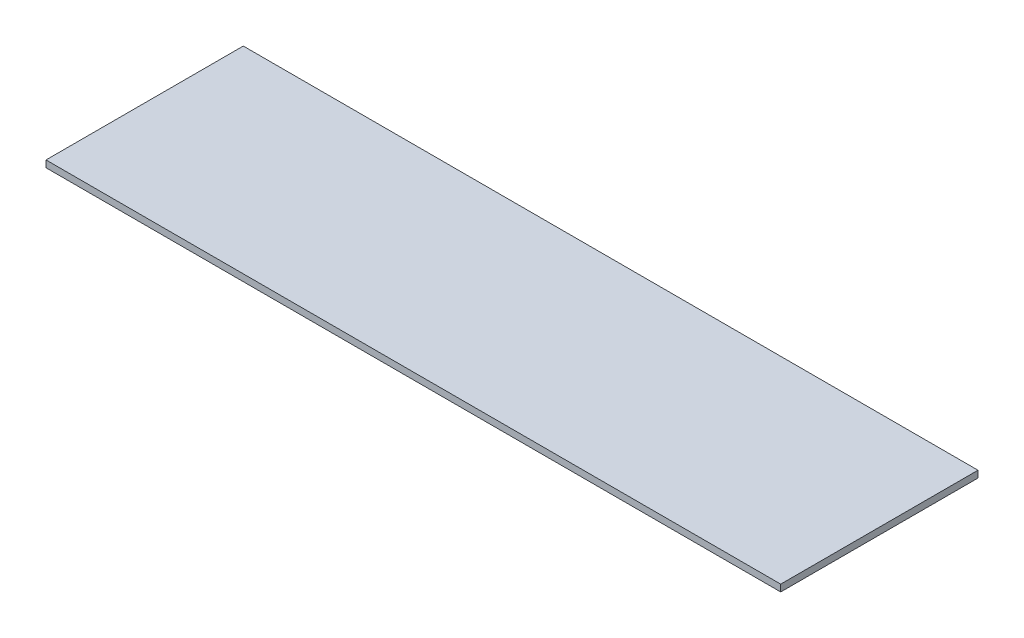
ISO-10303-21;
HEADER;
FILE_DESCRIPTION(('STEP AP214'),'2;1');
FILE_NAME('part.step','',(''),(''),'','','');
FILE_SCHEMA(('AUTOMOTIVE_DESIGN { 1 0 10303 214 1 1 1 1 }'));
ENDSEC;
DATA;
#1=APPLICATION_CONTEXT('core data for automotive mechanical design processes');
#2=APPLICATION_PROTOCOL_DEFINITION('international standard','automotive_design',2000,#1);
#3=PRODUCT_CONTEXT('',#1,'mechanical');
#4=PRODUCT('Part','Part','',(#3));
#5=PRODUCT_RELATED_PRODUCT_CATEGORY('part','',(#4));
#6=PRODUCT_DEFINITION_FORMATION('','',#4);
#7=PRODUCT_DEFINITION_CONTEXT('part definition',#1,'design');
#8=PRODUCT_DEFINITION('design','',#6,#7);
#9=PRODUCT_DEFINITION_SHAPE('','',#8);
#10=(LENGTH_UNIT() NAMED_UNIT(*) SI_UNIT(.MILLI.,.METRE.));
#11=(NAMED_UNIT(*) PLANE_ANGLE_UNIT() SI_UNIT($,.RADIAN.));
#12=(NAMED_UNIT(*) SI_UNIT($,.STERADIAN.) SOLID_ANGLE_UNIT());
#13=UNCERTAINTY_MEASURE_WITH_UNIT(LENGTH_MEASURE(1.E-05),#10,'distance_accuracy_value','');
#14=(GEOMETRIC_REPRESENTATION_CONTEXT(3) GLOBAL_UNCERTAINTY_ASSIGNED_CONTEXT((#13)) GLOBAL_UNIT_ASSIGNED_CONTEXT((#10,
#11,#12)) REPRESENTATION_CONTEXT('',''));
#15=CARTESIAN_POINT('',(0.,0.,0.));
#16=DIRECTION('',(0.,0.,1.));
#17=DIRECTION('',(1.,0.,0.));
#18=AXIS2_PLACEMENT_3D('',#15,#16,#17);
#19=CARTESIAN_POINT('',(0.,5.,0.));
#20=DIRECTION('',(-1.,0.,0.));
#21=DIRECTION('',(0.,0.,1.));
#22=AXIS2_PLACEMENT_3D('',#19,#20,#21);
#23=PLANE('',#22);
#24=DIRECTION('',(0.,0.,-1.));
#25=VECTOR('',#24,1.);
#26=CARTESIAN_POINT('',(0.,0.,0.));
#27=LINE('',#26,#25);
#28=CARTESIAN_POINT('',(0.,0.,145.));
#29=VERTEX_POINT('',#28);
#30=CARTESIAN_POINT('',(0.,0.,0.));
#31=VERTEX_POINT('',#30);
#32=EDGE_CURVE('E96',#29,#31,#27,.T.);
#33=ORIENTED_EDGE('',*,*,#32,.T.);
#34=DIRECTION('',(0.,-1.,0.));
#35=VECTOR('',#34,1.);
#36=CARTESIAN_POINT('',(0.,5.,0.));
#37=LINE('',#36,#35);
#38=CARTESIAN_POINT('',(0.,5.,0.));
#39=VERTEX_POINT('',#38);
#40=EDGE_CURVE('E11',#39,#31,#37,.T.);
#41=ORIENTED_EDGE('',*,*,#40,.F.);
#42=DIRECTION('',(0.,0.,-1.));
#43=VECTOR('',#42,1.);
#44=CARTESIAN_POINT('',(0.,5.,0.));
#45=LINE('',#44,#43);
#46=CARTESIAN_POINT('',(0.,5.,145.));
#47=VERTEX_POINT('',#46);
#48=EDGE_CURVE('E84',#47,#39,#45,.T.);
#49=ORIENTED_EDGE('',*,*,#48,.F.);
#50=DIRECTION('',(0.,-1.,0.));
#51=VECTOR('',#50,1.);
#52=CARTESIAN_POINT('',(0.,5.,145.));
#53=LINE('',#52,#51);
#54=EDGE_CURVE('E92',#47,#29,#53,.T.);
#55=ORIENTED_EDGE('',*,*,#54,.T.);
#56=EDGE_LOOP('',(#33,#41,#49,#55));
#57=FACE_BOUND('',#56,.T.);
#58=ADVANCED_FACE('F33',(#57),#23,.F.);
#59=CARTESIAN_POINT('',(0.,5.,0.));
#60=DIRECTION('',(0.,0.,1.));
#61=DIRECTION('',(1.,0.,0.));
#62=AXIS2_PLACEMENT_3D('',#59,#60,#61);
#63=PLANE('',#62);
#64=DIRECTION('',(-1.,0.,0.));
#65=VECTOR('',#64,1.);
#66=CARTESIAN_POINT('',(0.,0.,0.));
#67=LINE('',#66,#65);
#68=CARTESIAN_POINT('',(-540.,0.,0.));
#69=VERTEX_POINT('',#68);
#70=EDGE_CURVE('E88',#31,#69,#67,.T.);
#71=ORIENTED_EDGE('',*,*,#70,.T.);
#72=DIRECTION('',(0.,-1.,0.));
#73=VECTOR('',#72,1.);
#74=CARTESIAN_POINT('',(-540.,5.,0.));
#75=LINE('',#74,#73);
#76=CARTESIAN_POINT('',(-540.,5.,0.));
#77=VERTEX_POINT('',#76);
#78=EDGE_CURVE('E41',#77,#69,#75,.T.);
#79=ORIENTED_EDGE('',*,*,#78,.F.);
#80=DIRECTION('',(-1.,0.,0.));
#81=VECTOR('',#80,1.);
#82=CARTESIAN_POINT('',(0.,5.,0.));
#83=LINE('',#82,#81);
#84=EDGE_CURVE('E79',#39,#77,#83,.T.);
#85=ORIENTED_EDGE('',*,*,#84,.F.);
#86=ORIENTED_EDGE('',*,*,#40,.T.);
#87=EDGE_LOOP('',(#71,#79,#85,#86));
#88=FACE_BOUND('',#87,.T.);
#89=ADVANCED_FACE('F87',(#88),#63,.F.);
#90=CARTESIAN_POINT('',(-540.,5.,0.));
#91=DIRECTION('',(1.,0.,0.));
#92=DIRECTION('',(0.,0.,-1.));
#93=AXIS2_PLACEMENT_3D('',#90,#91,#92);
#94=PLANE('',#93);
#95=DIRECTION('',(0.,0.,1.));
#96=VECTOR('',#95,1.);
#97=CARTESIAN_POINT('',(-540.,0.,0.));
#98=LINE('',#97,#96);
#99=CARTESIAN_POINT('',(-540.,0.,145.));
#100=VERTEX_POINT('',#99);
#101=EDGE_CURVE('E66',#69,#100,#98,.T.);
#102=ORIENTED_EDGE('',*,*,#101,.T.);
#103=DIRECTION('',(0.,-1.,0.));
#104=VECTOR('',#103,1.);
#105=CARTESIAN_POINT('',(-540.,5.,145.));
#106=LINE('',#105,#104);
#107=CARTESIAN_POINT('',(-540.,5.,145.));
#108=VERTEX_POINT('',#107);
#109=EDGE_CURVE('E89',#108,#100,#106,.T.);
#110=ORIENTED_EDGE('',*,*,#109,.F.);
#111=DIRECTION('',(0.,0.,1.));
#112=VECTOR('',#111,1.);
#113=CARTESIAN_POINT('',(-540.,5.,0.));
#114=LINE('',#113,#112);
#115=EDGE_CURVE('E82',#77,#108,#114,.T.);
#116=ORIENTED_EDGE('',*,*,#115,.F.);
#117=ORIENTED_EDGE('',*,*,#78,.T.);
#118=EDGE_LOOP('',(#102,#110,#116,#117));
#119=FACE_BOUND('',#118,.T.);
#120=ADVANCED_FACE('F90',(#119),#94,.F.);
#121=CARTESIAN_POINT('',(0.,5.,145.));
#122=DIRECTION('',(0.,0.,-1.));
#123=DIRECTION('',(-1.,0.,0.));
#124=AXIS2_PLACEMENT_3D('',#121,#122,#123);
#125=PLANE('',#124);
#126=DIRECTION('',(1.,0.,0.));
#127=VECTOR('',#126,1.);
#128=CARTESIAN_POINT('',(0.,0.,145.));
#129=LINE('',#128,#127);
#130=EDGE_CURVE('E72',#100,#29,#129,.T.);
#131=ORIENTED_EDGE('',*,*,#130,.T.);
#132=ORIENTED_EDGE('',*,*,#54,.F.);
#133=DIRECTION('',(1.,0.,0.));
#134=VECTOR('',#133,1.);
#135=CARTESIAN_POINT('',(0.,5.,145.));
#136=LINE('',#135,#134);
#137=EDGE_CURVE('E49',#108,#47,#136,.T.);
#138=ORIENTED_EDGE('',*,*,#137,.F.);
#139=ORIENTED_EDGE('',*,*,#109,.T.);
#140=EDGE_LOOP('',(#131,#132,#138,#139));
#141=FACE_BOUND('',#140,.T.);
#142=ADVANCED_FACE('F103',(#141),#125,.F.);
#143=CARTESIAN_POINT('',(0.,5.,0.));
#144=DIRECTION('',(0.,-1.,0.));
#145=DIRECTION('',(0.,0.,-1.));
#146=AXIS2_PLACEMENT_3D('',#143,#144,#145);
#147=PLANE('',#146);
#148=ORIENTED_EDGE('',*,*,#48,.T.);
#149=ORIENTED_EDGE('',*,*,#84,.T.);
#150=ORIENTED_EDGE('',*,*,#115,.T.);
#151=ORIENTED_EDGE('',*,*,#137,.T.);
#152=EDGE_LOOP('',(#148,#149,#150,#151));
#153=FACE_BOUND('',#152,.T.);
#154=ADVANCED_FACE('F80',(#153),#147,.F.);
#155=CARTESIAN_POINT('',(0.,0.,0.));
#156=DIRECTION('',(0.,-1.,0.));
#157=DIRECTION('',(0.,0.,-1.));
#158=AXIS2_PLACEMENT_3D('',#155,#156,#157);
#159=PLANE('',#158);
#160=ORIENTED_EDGE('',*,*,#32,.F.);
#161=ORIENTED_EDGE('',*,*,#130,.F.);
#162=ORIENTED_EDGE('',*,*,#101,.F.);
#163=ORIENTED_EDGE('',*,*,#70,.F.);
#164=EDGE_LOOP('',(#160,#161,#162,#163));
#165=FACE_BOUND('',#164,.T.);
#166=ADVANCED_FACE('F106',(#165),#159,.T.);
#167=CLOSED_SHELL('',(#58,#89,#120,#142,#154,#166));
#168=MANIFOLD_SOLID_BREP('B2',#167);
#169=ADVANCED_BREP_SHAPE_REPRESENTATION('',(#18,#168),#14);
#170=SHAPE_DEFINITION_REPRESENTATION(#9,#169);
ENDSEC;
END-ISO-10303-21;
